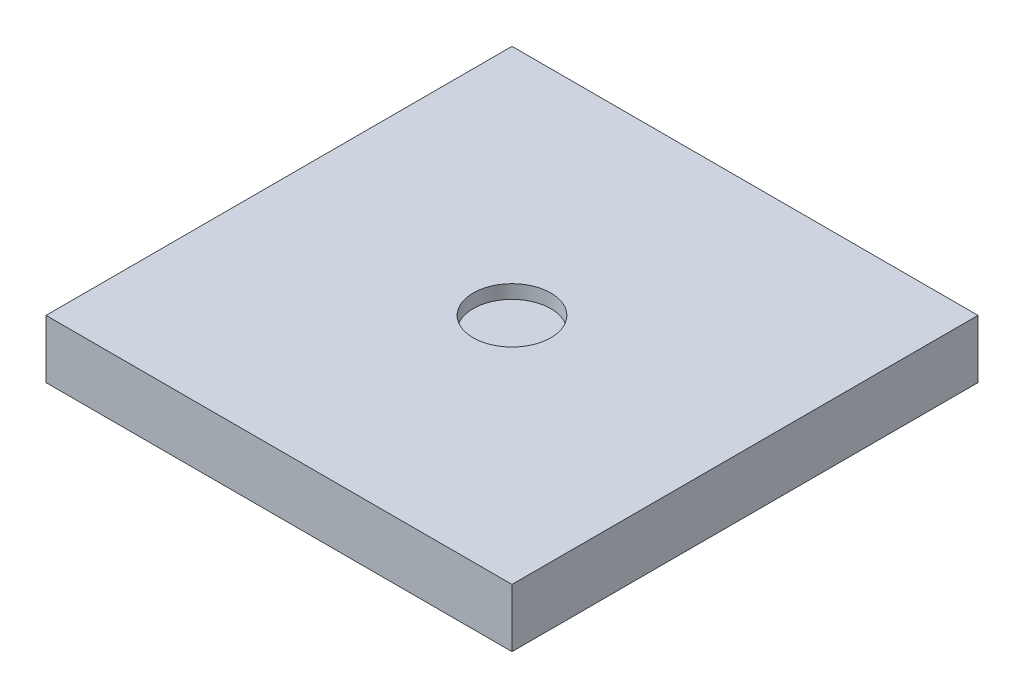
ISO-10303-21;
HEADER;
FILE_DESCRIPTION(('STEP AP214'),'2;1');
FILE_NAME('part.step','',(''),(''),'','','');
FILE_SCHEMA(('AUTOMOTIVE_DESIGN { 1 0 10303 214 1 1 1 1 }'));
ENDSEC;
DATA;
#1=APPLICATION_CONTEXT('core data for automotive mechanical design processes');
#2=APPLICATION_PROTOCOL_DEFINITION('international standard','automotive_design',2000,#1);
#3=PRODUCT_CONTEXT('',#1,'mechanical');
#4=PRODUCT('Part','Part','',(#3));
#5=PRODUCT_RELATED_PRODUCT_CATEGORY('part','',(#4));
#6=PRODUCT_DEFINITION_FORMATION('','',#4);
#7=PRODUCT_DEFINITION_CONTEXT('part definition',#1,'design');
#8=PRODUCT_DEFINITION('design','',#6,#7);
#9=PRODUCT_DEFINITION_SHAPE('','',#8);
#10=(LENGTH_UNIT() NAMED_UNIT(*) SI_UNIT(.MILLI.,.METRE.));
#11=(NAMED_UNIT(*) PLANE_ANGLE_UNIT() SI_UNIT($,.RADIAN.));
#12=(NAMED_UNIT(*) SI_UNIT($,.STERADIAN.) SOLID_ANGLE_UNIT());
#13=UNCERTAINTY_MEASURE_WITH_UNIT(LENGTH_MEASURE(1.E-05),#10,'distance_accuracy_value','');
#14=(GEOMETRIC_REPRESENTATION_CONTEXT(3) GLOBAL_UNCERTAINTY_ASSIGNED_CONTEXT((#13)) GLOBAL_UNIT_ASSIGNED_CONTEXT((#10,
#11,#12)) REPRESENTATION_CONTEXT('',''));
#15=CARTESIAN_POINT('',(0.,0.,0.));
#16=DIRECTION('',(0.,0.,1.));
#17=DIRECTION('',(1.,0.,0.));
#18=AXIS2_PLACEMENT_3D('',#15,#16,#17);
#19=CARTESIAN_POINT('',(76.2,19.05,-76.2));
#20=DIRECTION('',(-1.,0.,0.));
#21=DIRECTION('',(0.,0.,1.));
#22=AXIS2_PLACEMENT_3D('',#19,#20,#21);
#23=PLANE('',#22);
#24=DIRECTION('',(0.,0.,-1.));
#25=VECTOR('',#24,1.);
#26=CARTESIAN_POINT('',(76.2,0.,-76.2));
#27=LINE('',#26,#25);
#28=CARTESIAN_POINT('',(76.2,0.,76.2));
#29=VERTEX_POINT('',#28);
#30=CARTESIAN_POINT('',(76.2,0.,-76.2));
#31=VERTEX_POINT('',#30);
#32=EDGE_CURVE('E96',#29,#31,#27,.T.);
#33=ORIENTED_EDGE('',*,*,#32,.T.);
#34=DIRECTION('',(0.,-1.,0.));
#35=VECTOR('',#34,1.);
#36=CARTESIAN_POINT('',(76.2,19.05,-76.2));
#37=LINE('',#36,#35);
#38=CARTESIAN_POINT('',(76.2,19.05,-76.2));
#39=VERTEX_POINT('',#38);
#40=EDGE_CURVE('E11',#39,#31,#37,.T.);
#41=ORIENTED_EDGE('',*,*,#40,.F.);
#42=DIRECTION('',(0.,0.,-1.));
#43=VECTOR('',#42,1.);
#44=CARTESIAN_POINT('',(76.2,19.05,-76.2));
#45=LINE('',#44,#43);
#46=CARTESIAN_POINT('',(76.2,19.05,76.2));
#47=VERTEX_POINT('',#46);
#48=EDGE_CURVE('E84',#47,#39,#45,.T.);
#49=ORIENTED_EDGE('',*,*,#48,.F.);
#50=DIRECTION('',(0.,-1.,0.));
#51=VECTOR('',#50,1.);
#52=CARTESIAN_POINT('',(76.2,19.05,76.2));
#53=LINE('',#52,#51);
#54=EDGE_CURVE('E92',#47,#29,#53,.T.);
#55=ORIENTED_EDGE('',*,*,#54,.T.);
#56=EDGE_LOOP('',(#33,#41,#49,#55));
#57=FACE_BOUND('',#56,.T.);
#58=ADVANCED_FACE('F33',(#57),#23,.F.);
#59=CARTESIAN_POINT('',(-76.2,19.05,-76.2));
#60=DIRECTION('',(0.,0.,1.));
#61=DIRECTION('',(1.,0.,0.));
#62=AXIS2_PLACEMENT_3D('',#59,#60,#61);
#63=PLANE('',#62);
#64=DIRECTION('',(-1.,0.,0.));
#65=VECTOR('',#64,1.);
#66=CARTESIAN_POINT('',(-76.2,0.,-76.2));
#67=LINE('',#66,#65);
#68=CARTESIAN_POINT('',(-76.2,0.,-76.2));
#69=VERTEX_POINT('',#68);
#70=EDGE_CURVE('E88',#31,#69,#67,.T.);
#71=ORIENTED_EDGE('',*,*,#70,.T.);
#72=DIRECTION('',(0.,-1.,0.));
#73=VECTOR('',#72,1.);
#74=CARTESIAN_POINT('',(-76.2,19.05,-76.2));
#75=LINE('',#74,#73);
#76=CARTESIAN_POINT('',(-76.2,19.05,-76.2));
#77=VERTEX_POINT('',#76);
#78=EDGE_CURVE('E41',#77,#69,#75,.T.);
#79=ORIENTED_EDGE('',*,*,#78,.F.);
#80=DIRECTION('',(-1.,0.,0.));
#81=VECTOR('',#80,1.);
#82=CARTESIAN_POINT('',(-76.2,19.05,-76.2));
#83=LINE('',#82,#81);
#84=EDGE_CURVE('E79',#39,#77,#83,.T.);
#85=ORIENTED_EDGE('',*,*,#84,.F.);
#86=ORIENTED_EDGE('',*,*,#40,.T.);
#87=EDGE_LOOP('',(#71,#79,#85,#86));
#88=FACE_BOUND('',#87,.T.);
#89=ADVANCED_FACE('F87',(#88),#63,.F.);
#90=CARTESIAN_POINT('',(-76.2,19.05,-76.2));
#91=DIRECTION('',(1.,0.,0.));
#92=DIRECTION('',(0.,0.,-1.));
#93=AXIS2_PLACEMENT_3D('',#90,#91,#92);
#94=PLANE('',#93);
#95=DIRECTION('',(0.,0.,1.));
#96=VECTOR('',#95,1.);
#97=CARTESIAN_POINT('',(-76.2,0.,-76.2));
#98=LINE('',#97,#96);
#99=CARTESIAN_POINT('',(-76.2,0.,76.2));
#100=VERTEX_POINT('',#99);
#101=EDGE_CURVE('E66',#69,#100,#98,.T.);
#102=ORIENTED_EDGE('',*,*,#101,.T.);
#103=DIRECTION('',(0.,-1.,0.));
#104=VECTOR('',#103,1.);
#105=CARTESIAN_POINT('',(-76.2,19.05,76.2));
#106=LINE('',#105,#104);
#107=CARTESIAN_POINT('',(-76.2,19.05,76.2));
#108=VERTEX_POINT('',#107);
#109=EDGE_CURVE('E89',#108,#100,#106,.T.);
#110=ORIENTED_EDGE('',*,*,#109,.F.);
#111=DIRECTION('',(0.,0.,1.));
#112=VECTOR('',#111,1.);
#113=CARTESIAN_POINT('',(-76.2,19.05,-76.2));
#114=LINE('',#113,#112);
#115=EDGE_CURVE('E82',#77,#108,#114,.T.);
#116=ORIENTED_EDGE('',*,*,#115,.F.);
#117=ORIENTED_EDGE('',*,*,#78,.T.);
#118=EDGE_LOOP('',(#102,#110,#116,#117));
#119=FACE_BOUND('',#118,.T.);
#120=ADVANCED_FACE('F90',(#119),#94,.F.);
#121=CARTESIAN_POINT('',(-76.2,19.05,76.2));
#122=DIRECTION('',(0.,0.,-1.));
#123=DIRECTION('',(-1.,0.,0.));
#124=AXIS2_PLACEMENT_3D('',#121,#122,#123);
#125=PLANE('',#124);
#126=DIRECTION('',(1.,0.,0.));
#127=VECTOR('',#126,1.);
#128=CARTESIAN_POINT('',(-76.2,0.,76.2));
#129=LINE('',#128,#127);
#130=EDGE_CURVE('E72',#100,#29,#129,.T.);
#131=ORIENTED_EDGE('',*,*,#130,.T.);
#132=ORIENTED_EDGE('',*,*,#54,.F.);
#133=DIRECTION('',(1.,0.,0.));
#134=VECTOR('',#133,1.);
#135=CARTESIAN_POINT('',(-76.2,19.05,76.2));
#136=LINE('',#135,#134);
#137=EDGE_CURVE('E49',#108,#47,#136,.T.);
#138=ORIENTED_EDGE('',*,*,#137,.F.);
#139=ORIENTED_EDGE('',*,*,#109,.T.);
#140=EDGE_LOOP('',(#131,#132,#138,#139));
#141=FACE_BOUND('',#140,.T.);
#142=ADVANCED_FACE('F104',(#141),#125,.F.);
#143=CARTESIAN_POINT('',(0.,19.05,0.));
#144=DIRECTION('',(0.,1.,0.));
#145=DIRECTION('',(0.,0.,1.));
#146=AXIS2_PLACEMENT_3D('',#143,#144,#145);
#147=PLANE('',#146);
#148=CARTESIAN_POINT('',(0.,19.05,0.));
#149=DIRECTION('',(0.,1.,0.));
#150=DIRECTION('',(0.,0.,1.));
#151=AXIS2_PLACEMENT_3D('',#148,#149,#150);
#152=CIRCLE('',#151,12.7);
#153=CARTESIAN_POINT('',(0.,19.05,12.7));
#154=VERTEX_POINT('',#153);
#155=EDGE_CURVE('E110',#154,#154,#152,.T.);
#156=ORIENTED_EDGE('',*,*,#155,.F.);
#157=EDGE_LOOP('',(#156));
#158=FACE_BOUND('',#157,.T.);
#159=ORIENTED_EDGE('',*,*,#48,.T.);
#160=ORIENTED_EDGE('',*,*,#84,.T.);
#161=ORIENTED_EDGE('',*,*,#115,.T.);
#162=ORIENTED_EDGE('',*,*,#137,.T.);
#163=EDGE_LOOP('',(#159,#160,#161,#162));
#164=FACE_BOUND('',#163,.T.);
#165=ADVANCED_FACE('F80',(#158,#164),#147,.T.);
#166=CARTESIAN_POINT('',(0.,0.,0.));
#167=DIRECTION('',(0.,1.,0.));
#168=DIRECTION('',(0.,0.,1.));
#169=AXIS2_PLACEMENT_3D('',#166,#167,#168);
#170=PLANE('',#169);
#171=ORIENTED_EDGE('',*,*,#32,.F.);
#172=ORIENTED_EDGE('',*,*,#130,.F.);
#173=ORIENTED_EDGE('',*,*,#101,.F.);
#174=ORIENTED_EDGE('',*,*,#70,.F.);
#175=EDGE_LOOP('',(#171,#172,#173,#174));
#176=FACE_BOUND('',#175,.T.);
#177=ADVANCED_FACE('F107',(#176),#170,.F.);
#178=CARTESIAN_POINT('',(0.,14.605,0.));
#179=DIRECTION('',(0.,1.,0.));
#180=DIRECTION('',(0.,0.,1.));
#181=AXIS2_PLACEMENT_3D('',#178,#179,#180);
#182=CYLINDRICAL_SURFACE('',#181,12.7);
#183=CARTESIAN_POINT('',(0.,14.605,0.));
#184=DIRECTION('',(0.,1.,0.));
#185=DIRECTION('',(0.,0.,1.));
#186=AXIS2_PLACEMENT_3D('',#183,#184,#185);
#187=CIRCLE('',#186,12.7);
#188=CARTESIAN_POINT('',(0.,14.605,12.7));
#189=VERTEX_POINT('',#188);
#190=EDGE_CURVE('E99',#189,#189,#187,.T.);
#191=ORIENTED_EDGE('',*,*,#190,.F.);
#192=EDGE_LOOP('',(#191));
#193=FACE_BOUND('',#192,.T.);
#194=ORIENTED_EDGE('',*,*,#155,.T.);
#195=EDGE_LOOP('',(#194));
#196=FACE_BOUND('',#195,.T.);
#197=ADVANCED_FACE('F118',(#193,#196),#182,.F.);
#198=CARTESIAN_POINT('',(0.,14.605,0.));
#199=DIRECTION('',(0.,1.,0.));
#200=DIRECTION('',(0.,0.,1.));
#201=AXIS2_PLACEMENT_3D('',#198,#199,#200);
#202=PLANE('',#201);
#203=ORIENTED_EDGE('',*,*,#190,.T.);
#204=EDGE_LOOP('',(#203));
#205=FACE_BOUND('',#204,.T.);
#206=ADVANCED_FACE('F116',(#205),#202,.T.);
#207=CLOSED_SHELL('',(#58,#89,#120,#142,#165,#177,#197,#206));
#208=MANIFOLD_SOLID_BREP('B2',#207);
#209=ADVANCED_BREP_SHAPE_REPRESENTATION('',(#18,#208),#14);
#210=SHAPE_DEFINITION_REPRESENTATION(#9,#209);
ENDSEC;
END-ISO-10303-21;
